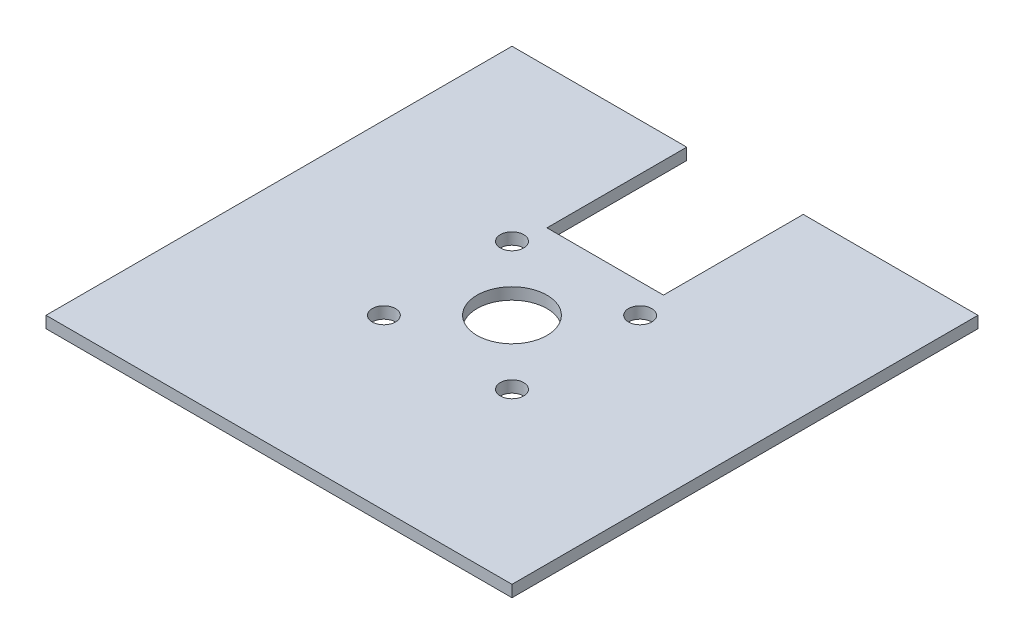
ISO-10303-21;
HEADER;
FILE_DESCRIPTION(('STEP AP214'),'2;1');
FILE_NAME('part.step','',(''),(''),'','','');
FILE_SCHEMA(('AUTOMOTIVE_DESIGN { 1 0 10303 214 1 1 1 1 }'));
ENDSEC;
DATA;
#1=APPLICATION_CONTEXT('core data for automotive mechanical design processes');
#2=APPLICATION_PROTOCOL_DEFINITION('international standard','automotive_design',2000,#1);
#3=PRODUCT_CONTEXT('',#1,'mechanical');
#4=PRODUCT('Part','Part','',(#3));
#5=PRODUCT_RELATED_PRODUCT_CATEGORY('part','',(#4));
#6=PRODUCT_DEFINITION_FORMATION('','',#4);
#7=PRODUCT_DEFINITION_CONTEXT('part definition',#1,'design');
#8=PRODUCT_DEFINITION('design','',#6,#7);
#9=PRODUCT_DEFINITION_SHAPE('','',#8);
#10=(LENGTH_UNIT() NAMED_UNIT(*) SI_UNIT(.MILLI.,.METRE.));
#11=(NAMED_UNIT(*) PLANE_ANGLE_UNIT() SI_UNIT($,.RADIAN.));
#12=(NAMED_UNIT(*) SI_UNIT($,.STERADIAN.) SOLID_ANGLE_UNIT());
#13=UNCERTAINTY_MEASURE_WITH_UNIT(LENGTH_MEASURE(1.E-05),#10,'distance_accuracy_value','');
#14=(GEOMETRIC_REPRESENTATION_CONTEXT(3) GLOBAL_UNCERTAINTY_ASSIGNED_CONTEXT((#13)) GLOBAL_UNIT_ASSIGNED_CONTEXT((#10,
#11,#12)) REPRESENTATION_CONTEXT('',''));
#15=CARTESIAN_POINT('',(0.,0.,0.));
#16=DIRECTION('',(0.,0.,1.));
#17=DIRECTION('',(1.,0.,0.));
#18=AXIS2_PLACEMENT_3D('',#15,#16,#17);
#19=CARTESIAN_POINT('',(0.,3.175,0.));
#20=DIRECTION('',(0.,1.,0.));
#21=DIRECTION('',(0.,0.,1.));
#22=AXIS2_PLACEMENT_3D('',#19,#20,#21);
#23=PLANE('',#22);
#24=CARTESIAN_POINT('',(34.9249999999997,3.175,34.9250000000002));
#25=DIRECTION('',(0.,1.,0.));
#26=DIRECTION('',(0.,0.,1.));
#27=AXIS2_PLACEMENT_3D('',#24,#25,#26);
#28=CIRCLE('',#27,6.35000000000002);
#29=CARTESIAN_POINT('',(34.9249999999997,3.175,41.2750000000002));
#30=VERTEX_POINT('',#29);
#31=EDGE_CURVE('E194',#30,#30,#28,.T.);
#32=ORIENTED_EDGE('',*,*,#31,.F.);
#33=EDGE_LOOP('',(#32));
#34=FACE_BOUND('',#33,.T.);
#35=CARTESIAN_POINT('',(-34.925,3.175,-34.925));
#36=DIRECTION('',(0.,1.,0.));
#37=DIRECTION('',(0.,0.,1.));
#38=AXIS2_PLACEMENT_3D('',#35,#36,#37);
#39=CIRCLE('',#38,6.35);
#40=CARTESIAN_POINT('',(-34.925,3.175,-28.575));
#41=VERTEX_POINT('',#40);
#42=EDGE_CURVE('E182',#41,#41,#39,.T.);
#43=ORIENTED_EDGE('',*,*,#42,.F.);
#44=EDGE_LOOP('',(#43));
#45=FACE_BOUND('',#44,.T.);
#46=DIRECTION('',(-1.,0.,0.));
#47=VECTOR('',#46,1.);
#48=CARTESIAN_POINT('',(31.7499999999998,3.175,-127.));
#49=LINE('',#48,#47);
#50=CARTESIAN_POINT('',(127.,3.175,-127.));
#51=VERTEX_POINT('',#50);
#52=CARTESIAN_POINT('',(31.7499999999998,3.175,-127.));
#53=VERTEX_POINT('',#52);
#54=EDGE_CURVE('E145',#51,#53,#49,.T.);
#55=ORIENTED_EDGE('',*,*,#54,.T.);
#56=DIRECTION('',(0.,0.,1.));
#57=VECTOR('',#56,1.);
#58=CARTESIAN_POINT('',(31.75,3.175,-50.8));
#59=LINE('',#58,#57);
#60=CARTESIAN_POINT('',(31.75,3.175,-50.8));
#61=VERTEX_POINT('',#60);
#62=EDGE_CURVE('E93',#53,#61,#59,.T.);
#63=ORIENTED_EDGE('',*,*,#62,.T.);
#64=DIRECTION('',(-1.,0.,0.));
#65=VECTOR('',#64,1.);
#66=CARTESIAN_POINT('',(-31.75,3.175,-50.8));
#67=LINE('',#66,#65);
#68=CARTESIAN_POINT('',(-31.75,3.175,-50.8));
#69=VERTEX_POINT('',#68);
#70=EDGE_CURVE('E160',#61,#69,#67,.T.);
#71=ORIENTED_EDGE('',*,*,#70,.T.);
#72=DIRECTION('',(0.,0.,-1.));
#73=VECTOR('',#72,1.);
#74=CARTESIAN_POINT('',(-31.75,3.175,-50.8));
#75=LINE('',#74,#73);
#76=CARTESIAN_POINT('',(-31.7500000000002,3.175,-127.));
#77=VERTEX_POINT('',#76);
#78=EDGE_CURVE('E173',#69,#77,#75,.T.);
#79=ORIENTED_EDGE('',*,*,#78,.T.);
#80=DIRECTION('',(-1.,0.,0.));
#81=VECTOR('',#80,1.);
#82=CARTESIAN_POINT('',(-127.,3.175,-127.));
#83=LINE('',#82,#81);
#84=CARTESIAN_POINT('',(-127.,3.175,-127.));
#85=VERTEX_POINT('',#84);
#86=EDGE_CURVE('E112',#77,#85,#83,.T.);
#87=ORIENTED_EDGE('',*,*,#86,.T.);
#88=DIRECTION('',(0.,0.,1.));
#89=VECTOR('',#88,1.);
#90=CARTESIAN_POINT('',(-127.,3.175,127.));
#91=LINE('',#90,#89);
#92=CARTESIAN_POINT('',(-127.,3.175,127.));
#93=VERTEX_POINT('',#92);
#94=EDGE_CURVE('E106',#85,#93,#91,.T.);
#95=ORIENTED_EDGE('',*,*,#94,.T.);
#96=DIRECTION('',(1.,0.,0.));
#97=VECTOR('',#96,1.);
#98=CARTESIAN_POINT('',(-127.,3.175,127.));
#99=LINE('',#98,#97);
#100=CARTESIAN_POINT('',(127.,3.175,127.));
#101=VERTEX_POINT('',#100);
#102=EDGE_CURVE('E110',#93,#101,#99,.T.);
#103=ORIENTED_EDGE('',*,*,#102,.T.);
#104=DIRECTION('',(0.,0.,-1.));
#105=VECTOR('',#104,1.);
#106=CARTESIAN_POINT('',(127.,3.175,127.));
#107=LINE('',#106,#105);
#108=EDGE_CURVE('E50',#101,#51,#107,.T.);
#109=ORIENTED_EDGE('',*,*,#108,.T.);
#110=EDGE_LOOP('',(#55,#63,#71,#79,#87,#95,#103,#109));
#111=FACE_BOUND('',#110,.T.);
#112=CARTESIAN_POINT('',(0.,3.175,0.));
#113=DIRECTION('',(0.,1.,0.));
#114=DIRECTION('',(0.,0.,1.));
#115=AXIS2_PLACEMENT_3D('',#112,#113,#114);
#116=CIRCLE('',#115,19.05);
#117=CARTESIAN_POINT('',(0.,3.175,19.05));
#118=VERTEX_POINT('',#117);
#119=EDGE_CURVE('E134',#118,#118,#116,.T.);
#120=ORIENTED_EDGE('',*,*,#119,.F.);
#121=EDGE_LOOP('',(#120));
#122=FACE_BOUND('',#121,.T.);
#123=CARTESIAN_POINT('',(34.9249999999997,3.175,-34.9250000000002));
#124=DIRECTION('',(0.,1.,0.));
#125=DIRECTION('',(0.,0.,-1.));
#126=AXIS2_PLACEMENT_3D('',#123,#124,#125);
#127=CIRCLE('',#126,6.35000000000002);
#128=CARTESIAN_POINT('',(34.9249999999997,3.175,-41.2750000000002));
#129=VERTEX_POINT('',#128);
#130=EDGE_CURVE('E188',#129,#129,#127,.T.);
#131=ORIENTED_EDGE('',*,*,#130,.F.);
#132=EDGE_LOOP('',(#131));
#133=FACE_BOUND('',#132,.T.);
#134=CARTESIAN_POINT('',(-34.925,3.175,34.925));
#135=DIRECTION('',(0.,1.,0.));
#136=DIRECTION('',(0.,0.,-1.));
#137=AXIS2_PLACEMENT_3D('',#134,#135,#136);
#138=CIRCLE('',#137,6.35);
#139=CARTESIAN_POINT('',(-34.925,3.175,28.575));
#140=VERTEX_POINT('',#139);
#141=EDGE_CURVE('E200',#140,#140,#138,.T.);
#142=ORIENTED_EDGE('',*,*,#141,.F.);
#143=EDGE_LOOP('',(#142));
#144=FACE_BOUND('',#143,.T.);
#145=ADVANCED_FACE('F33',(#34,#45,#111,#122,#133,#144),#23,.T.);
#146=CARTESIAN_POINT('',(0.,-3.175,0.));
#147=DIRECTION('',(0.,1.,0.));
#148=DIRECTION('',(0.,0.,1.));
#149=AXIS2_PLACEMENT_3D('',#146,#147,#148);
#150=PLANE('',#149);
#151=DIRECTION('',(-1.,0.,0.));
#152=VECTOR('',#151,1.);
#153=CARTESIAN_POINT('',(31.7499999999998,-3.175,-127.));
#154=LINE('',#153,#152);
#155=CARTESIAN_POINT('',(127.,-3.175,-127.));
#156=VERTEX_POINT('',#155);
#157=CARTESIAN_POINT('',(31.7499999999998,-3.175,-127.));
#158=VERTEX_POINT('',#157);
#159=EDGE_CURVE('E130',#156,#158,#154,.T.);
#160=ORIENTED_EDGE('',*,*,#159,.F.);
#161=DIRECTION('',(0.,0.,-1.));
#162=VECTOR('',#161,1.);
#163=CARTESIAN_POINT('',(127.,-3.175,127.));
#164=LINE('',#163,#162);
#165=CARTESIAN_POINT('',(127.,-3.175,127.));
#166=VERTEX_POINT('',#165);
#167=EDGE_CURVE('E85',#166,#156,#164,.T.);
#168=ORIENTED_EDGE('',*,*,#167,.F.);
#169=DIRECTION('',(1.,0.,0.));
#170=VECTOR('',#169,1.);
#171=CARTESIAN_POINT('',(-127.,-3.175,127.));
#172=LINE('',#171,#170);
#173=CARTESIAN_POINT('',(-127.,-3.175,127.));
#174=VERTEX_POINT('',#173);
#175=EDGE_CURVE('E79',#174,#166,#172,.T.);
#176=ORIENTED_EDGE('',*,*,#175,.F.);
#177=DIRECTION('',(0.,0.,1.));
#178=VECTOR('',#177,1.);
#179=CARTESIAN_POINT('',(-127.,-3.175,127.));
#180=LINE('',#179,#178);
#181=CARTESIAN_POINT('',(-127.,-3.175,-127.));
#182=VERTEX_POINT('',#181);
#183=EDGE_CURVE('E120',#182,#174,#180,.T.);
#184=ORIENTED_EDGE('',*,*,#183,.F.);
#185=DIRECTION('',(-1.,0.,0.));
#186=VECTOR('',#185,1.);
#187=CARTESIAN_POINT('',(-127.,-3.175,-127.));
#188=LINE('',#187,#186);
#189=CARTESIAN_POINT('',(-31.7500000000002,-3.175,-127.));
#190=VERTEX_POINT('',#189);
#191=EDGE_CURVE('E140',#190,#182,#188,.T.);
#192=ORIENTED_EDGE('',*,*,#191,.F.);
#193=DIRECTION('',(0.,0.,-1.));
#194=VECTOR('',#193,1.);
#195=CARTESIAN_POINT('',(-31.75,-3.175,-50.8));
#196=LINE('',#195,#194);
#197=CARTESIAN_POINT('',(-31.75,-3.175,-50.8));
#198=VERTEX_POINT('',#197);
#199=EDGE_CURVE('E138',#198,#190,#196,.T.);
#200=ORIENTED_EDGE('',*,*,#199,.F.);
#201=DIRECTION('',(-1.,0.,0.));
#202=VECTOR('',#201,1.);
#203=CARTESIAN_POINT('',(-31.75,-3.175,-50.8));
#204=LINE('',#203,#202);
#205=CARTESIAN_POINT('',(31.75,-3.175,-50.8));
#206=VERTEX_POINT('',#205);
#207=EDGE_CURVE('E136',#206,#198,#204,.T.);
#208=ORIENTED_EDGE('',*,*,#207,.F.);
#209=DIRECTION('',(0.,0.,1.));
#210=VECTOR('',#209,1.);
#211=CARTESIAN_POINT('',(31.75,-3.175,-50.8));
#212=LINE('',#211,#210);
#213=EDGE_CURVE('E133',#158,#206,#212,.T.);
#214=ORIENTED_EDGE('',*,*,#213,.F.);
#215=EDGE_LOOP('',(#160,#168,#176,#184,#192,#200,#208,#214));
#216=FACE_BOUND('',#215,.T.);
#217=CARTESIAN_POINT('',(0.,-3.175,0.));
#218=DIRECTION('',(0.,1.,0.));
#219=DIRECTION('',(0.,0.,1.));
#220=AXIS2_PLACEMENT_3D('',#217,#218,#219);
#221=CIRCLE('',#220,19.05);
#222=CARTESIAN_POINT('',(0.,-3.175,19.05));
#223=VERTEX_POINT('',#222);
#224=EDGE_CURVE('E179',#223,#223,#221,.T.);
#225=ORIENTED_EDGE('',*,*,#224,.T.);
#226=EDGE_LOOP('',(#225));
#227=FACE_BOUND('',#226,.T.);
#228=CARTESIAN_POINT('',(-34.925,-3.175,-34.925));
#229=DIRECTION('',(0.,1.,0.));
#230=DIRECTION('',(0.,0.,1.));
#231=AXIS2_PLACEMENT_3D('',#228,#229,#230);
#232=CIRCLE('',#231,6.35);
#233=CARTESIAN_POINT('',(-34.925,-3.175,-28.575));
#234=VERTEX_POINT('',#233);
#235=EDGE_CURVE('E185',#234,#234,#232,.T.);
#236=ORIENTED_EDGE('',*,*,#235,.T.);
#237=EDGE_LOOP('',(#236));
#238=FACE_BOUND('',#237,.T.);
#239=CARTESIAN_POINT('',(34.9249999999997,-3.175,-34.9250000000002));
#240=DIRECTION('',(0.,1.,0.));
#241=DIRECTION('',(0.,0.,-1.));
#242=AXIS2_PLACEMENT_3D('',#239,#240,#241);
#243=CIRCLE('',#242,6.35000000000002);
#244=CARTESIAN_POINT('',(34.9249999999997,-3.175,-41.2750000000002));
#245=VERTEX_POINT('',#244);
#246=EDGE_CURVE('E191',#245,#245,#243,.T.);
#247=ORIENTED_EDGE('',*,*,#246,.T.);
#248=EDGE_LOOP('',(#247));
#249=FACE_BOUND('',#248,.T.);
#250=CARTESIAN_POINT('',(34.9249999999997,-3.175,34.9250000000002));
#251=DIRECTION('',(0.,1.,0.));
#252=DIRECTION('',(0.,0.,1.));
#253=AXIS2_PLACEMENT_3D('',#250,#251,#252);
#254=CIRCLE('',#253,6.35000000000002);
#255=CARTESIAN_POINT('',(34.9249999999997,-3.175,41.2750000000002));
#256=VERTEX_POINT('',#255);
#257=EDGE_CURVE('E197',#256,#256,#254,.T.);
#258=ORIENTED_EDGE('',*,*,#257,.T.);
#259=EDGE_LOOP('',(#258));
#260=FACE_BOUND('',#259,.T.);
#261=CARTESIAN_POINT('',(-34.925,-3.175,34.925));
#262=DIRECTION('',(0.,1.,0.));
#263=DIRECTION('',(0.,0.,-1.));
#264=AXIS2_PLACEMENT_3D('',#261,#262,#263);
#265=CIRCLE('',#264,6.35);
#266=CARTESIAN_POINT('',(-34.925,-3.175,28.575));
#267=VERTEX_POINT('',#266);
#268=EDGE_CURVE('E203',#267,#267,#265,.T.);
#269=ORIENTED_EDGE('',*,*,#268,.T.);
#270=EDGE_LOOP('',(#269));
#271=FACE_BOUND('',#270,.T.);
#272=ADVANCED_FACE('F164',(#216,#227,#238,#249,#260,#271),#150,.F.);
#273=CARTESIAN_POINT('',(31.7499999999998,3.175,-127.));
#274=DIRECTION('',(0.,0.,1.));
#275=DIRECTION('',(1.,0.,0.));
#276=AXIS2_PLACEMENT_3D('',#273,#274,#275);
#277=PLANE('',#276);
#278=ORIENTED_EDGE('',*,*,#159,.T.);
#279=DIRECTION('',(0.,-1.,0.));
#280=VECTOR('',#279,1.);
#281=CARTESIAN_POINT('',(31.7499999999998,3.175,-127.));
#282=LINE('',#281,#280);
#283=EDGE_CURVE('E11',#53,#158,#282,.T.);
#284=ORIENTED_EDGE('',*,*,#283,.F.);
#285=ORIENTED_EDGE('',*,*,#54,.F.);
#286=DIRECTION('',(0.,-1.,0.));
#287=VECTOR('',#286,1.);
#288=CARTESIAN_POINT('',(127.,3.175,-127.));
#289=LINE('',#288,#287);
#290=EDGE_CURVE('E126',#51,#156,#289,.T.);
#291=ORIENTED_EDGE('',*,*,#290,.T.);
#292=EDGE_LOOP('',(#278,#284,#285,#291));
#293=FACE_BOUND('',#292,.T.);
#294=ADVANCED_FACE('F35',(#293),#277,.F.);
#295=CARTESIAN_POINT('',(31.75,3.175,-50.8));
#296=DIRECTION('',(1.,0.,0.));
#297=DIRECTION('',(0.,0.,-1.));
#298=AXIS2_PLACEMENT_3D('',#295,#296,#297);
#299=PLANE('',#298);
#300=ORIENTED_EDGE('',*,*,#213,.T.);
#301=DIRECTION('',(0.,-1.,0.));
#302=VECTOR('',#301,1.);
#303=CARTESIAN_POINT('',(31.75,3.175,-50.8));
#304=LINE('',#303,#302);
#305=EDGE_CURVE('E42',#61,#206,#304,.T.);
#306=ORIENTED_EDGE('',*,*,#305,.F.);
#307=ORIENTED_EDGE('',*,*,#62,.F.);
#308=ORIENTED_EDGE('',*,*,#283,.T.);
#309=EDGE_LOOP('',(#300,#306,#307,#308));
#310=FACE_BOUND('',#309,.T.);
#311=ADVANCED_FACE('F237',(#310),#299,.F.);
#312=CARTESIAN_POINT('',(-31.75,3.175,-50.8));
#313=DIRECTION('',(0.,0.,1.));
#314=DIRECTION('',(1.,0.,0.));
#315=AXIS2_PLACEMENT_3D('',#312,#313,#314);
#316=PLANE('',#315);
#317=ORIENTED_EDGE('',*,*,#207,.T.);
#318=DIRECTION('',(0.,-1.,0.));
#319=VECTOR('',#318,1.);
#320=CARTESIAN_POINT('',(-31.75,3.175,-50.8));
#321=LINE('',#320,#319);
#322=EDGE_CURVE('E152',#69,#198,#321,.T.);
#323=ORIENTED_EDGE('',*,*,#322,.F.);
#324=ORIENTED_EDGE('',*,*,#70,.F.);
#325=ORIENTED_EDGE('',*,*,#305,.T.);
#326=EDGE_LOOP('',(#317,#323,#324,#325));
#327=FACE_BOUND('',#326,.T.);
#328=ADVANCED_FACE('F158',(#327),#316,.F.);
#329=CARTESIAN_POINT('',(-31.75,3.175,-50.8));
#330=DIRECTION('',(-1.,0.,0.));
#331=DIRECTION('',(0.,0.,1.));
#332=AXIS2_PLACEMENT_3D('',#329,#330,#331);
#333=PLANE('',#332);
#334=ORIENTED_EDGE('',*,*,#199,.T.);
#335=DIRECTION('',(0.,-1.,0.));
#336=VECTOR('',#335,1.);
#337=CARTESIAN_POINT('',(-31.7500000000002,3.175,-127.));
#338=LINE('',#337,#336);
#339=EDGE_CURVE('E149',#77,#190,#338,.T.);
#340=ORIENTED_EDGE('',*,*,#339,.F.);
#341=ORIENTED_EDGE('',*,*,#78,.F.);
#342=ORIENTED_EDGE('',*,*,#322,.T.);
#343=EDGE_LOOP('',(#334,#340,#341,#342));
#344=FACE_BOUND('',#343,.T.);
#345=ADVANCED_FACE('F169',(#344),#333,.F.);
#346=CARTESIAN_POINT('',(-127.,3.175,-127.));
#347=DIRECTION('',(0.,0.,1.));
#348=DIRECTION('',(1.,0.,0.));
#349=AXIS2_PLACEMENT_3D('',#346,#347,#348);
#350=PLANE('',#349);
#351=ORIENTED_EDGE('',*,*,#191,.T.);
#352=DIRECTION('',(0.,-1.,0.));
#353=VECTOR('',#352,1.);
#354=CARTESIAN_POINT('',(-127.,3.175,-127.));
#355=LINE('',#354,#353);
#356=EDGE_CURVE('E121',#85,#182,#355,.T.);
#357=ORIENTED_EDGE('',*,*,#356,.F.);
#358=ORIENTED_EDGE('',*,*,#86,.F.);
#359=ORIENTED_EDGE('',*,*,#339,.T.);
#360=EDGE_LOOP('',(#351,#357,#358,#359));
#361=FACE_BOUND('',#360,.T.);
#362=ADVANCED_FACE('F172',(#361),#350,.F.);
#363=CARTESIAN_POINT('',(-127.,3.175,127.));
#364=DIRECTION('',(1.,0.,0.));
#365=DIRECTION('',(0.,0.,-1.));
#366=AXIS2_PLACEMENT_3D('',#363,#364,#365);
#367=PLANE('',#366);
#368=ORIENTED_EDGE('',*,*,#183,.T.);
#369=DIRECTION('',(0.,-1.,0.));
#370=VECTOR('',#369,1.);
#371=CARTESIAN_POINT('',(-127.,3.175,127.));
#372=LINE('',#371,#370);
#373=EDGE_CURVE('E117',#93,#174,#372,.T.);
#374=ORIENTED_EDGE('',*,*,#373,.F.);
#375=ORIENTED_EDGE('',*,*,#94,.F.);
#376=ORIENTED_EDGE('',*,*,#356,.T.);
#377=EDGE_LOOP('',(#368,#374,#375,#376));
#378=FACE_BOUND('',#377,.T.);
#379=ADVANCED_FACE('F118',(#378),#367,.F.);
#380=CARTESIAN_POINT('',(-127.,3.175,127.));
#381=DIRECTION('',(0.,0.,-1.));
#382=DIRECTION('',(-1.,0.,0.));
#383=AXIS2_PLACEMENT_3D('',#380,#381,#382);
#384=PLANE('',#383);
#385=ORIENTED_EDGE('',*,*,#175,.T.);
#386=DIRECTION('',(0.,-1.,0.));
#387=VECTOR('',#386,1.);
#388=CARTESIAN_POINT('',(127.,3.175,127.));
#389=LINE('',#388,#387);
#390=EDGE_CURVE('E122',#101,#166,#389,.T.);
#391=ORIENTED_EDGE('',*,*,#390,.F.);
#392=ORIENTED_EDGE('',*,*,#102,.F.);
#393=ORIENTED_EDGE('',*,*,#373,.T.);
#394=EDGE_LOOP('',(#385,#391,#392,#393));
#395=FACE_BOUND('',#394,.T.);
#396=ADVANCED_FACE('F124',(#395),#384,.F.);
#397=CARTESIAN_POINT('',(127.,3.175,127.));
#398=DIRECTION('',(-1.,0.,0.));
#399=DIRECTION('',(0.,0.,1.));
#400=AXIS2_PLACEMENT_3D('',#397,#398,#399);
#401=PLANE('',#400);
#402=ORIENTED_EDGE('',*,*,#167,.T.);
#403=ORIENTED_EDGE('',*,*,#290,.F.);
#404=ORIENTED_EDGE('',*,*,#108,.F.);
#405=ORIENTED_EDGE('',*,*,#390,.T.);
#406=EDGE_LOOP('',(#402,#403,#404,#405));
#407=FACE_BOUND('',#406,.T.);
#408=ADVANCED_FACE('F225',(#407),#401,.F.);
#409=CARTESIAN_POINT('',(0.,3.175,0.));
#410=DIRECTION('',(0.,-1.,0.));
#411=DIRECTION('',(0.,0.,-1.));
#412=AXIS2_PLACEMENT_3D('',#409,#410,#411);
#413=CYLINDRICAL_SURFACE('',#412,19.05);
#414=ORIENTED_EDGE('',*,*,#119,.T.);
#415=EDGE_LOOP('',(#414));
#416=FACE_BOUND('',#415,.T.);
#417=ORIENTED_EDGE('',*,*,#224,.F.);
#418=EDGE_LOOP('',(#417));
#419=FACE_BOUND('',#418,.T.);
#420=ADVANCED_FACE('F222',(#416,#419),#413,.F.);
#421=CARTESIAN_POINT('',(-34.925,3.175,-34.925));
#422=DIRECTION('',(0.,-1.,0.));
#423=DIRECTION('',(0.,0.,-1.));
#424=AXIS2_PLACEMENT_3D('',#421,#422,#423);
#425=CYLINDRICAL_SURFACE('',#424,6.35);
#426=ORIENTED_EDGE('',*,*,#42,.T.);
#427=EDGE_LOOP('',(#426));
#428=FACE_BOUND('',#427,.T.);
#429=ORIENTED_EDGE('',*,*,#235,.F.);
#430=EDGE_LOOP('',(#429));
#431=FACE_BOUND('',#430,.T.);
#432=ADVANCED_FACE('F301',(#428,#431),#425,.F.);
#433=CARTESIAN_POINT('',(34.9249999999997,3.175,-34.9250000000002));
#434=DIRECTION('',(0.,-1.,0.));
#435=DIRECTION('',(0.,0.,-1.));
#436=AXIS2_PLACEMENT_3D('',#433,#434,#435);
#437=CYLINDRICAL_SURFACE('',#436,6.35000000000002);
#438=ORIENTED_EDGE('',*,*,#130,.T.);
#439=EDGE_LOOP('',(#438));
#440=FACE_BOUND('',#439,.T.);
#441=ORIENTED_EDGE('',*,*,#246,.F.);
#442=EDGE_LOOP('',(#441));
#443=FACE_BOUND('',#442,.T.);
#444=ADVANCED_FACE('F309',(#440,#443),#437,.F.);
#445=CARTESIAN_POINT('',(34.9249999999997,3.175,34.9250000000002));
#446=DIRECTION('',(0.,-1.,0.));
#447=DIRECTION('',(0.,0.,-1.));
#448=AXIS2_PLACEMENT_3D('',#445,#446,#447);
#449=CYLINDRICAL_SURFACE('',#448,6.35000000000002);
#450=ORIENTED_EDGE('',*,*,#31,.T.);
#451=EDGE_LOOP('',(#450));
#452=FACE_BOUND('',#451,.T.);
#453=ORIENTED_EDGE('',*,*,#257,.F.);
#454=EDGE_LOOP('',(#453));
#455=FACE_BOUND('',#454,.T.);
#456=ADVANCED_FACE('F317',(#452,#455),#449,.F.);
#457=CARTESIAN_POINT('',(-34.925,3.175,34.925));
#458=DIRECTION('',(0.,-1.,0.));
#459=DIRECTION('',(0.,0.,-1.));
#460=AXIS2_PLACEMENT_3D('',#457,#458,#459);
#461=CYLINDRICAL_SURFACE('',#460,6.35);
#462=ORIENTED_EDGE('',*,*,#141,.T.);
#463=EDGE_LOOP('',(#462));
#464=FACE_BOUND('',#463,.T.);
#465=ORIENTED_EDGE('',*,*,#268,.F.);
#466=EDGE_LOOP('',(#465));
#467=FACE_BOUND('',#466,.T.);
#468=ADVANCED_FACE('F209',(#464,#467),#461,.F.);
#469=CLOSED_SHELL('',(#145,#272,#294,#311,#328,#345,#362,#379,#396,#408,#420,#432,#444,#456,#468));
#470=MANIFOLD_SOLID_BREP('B2',#469);
#471=ADVANCED_BREP_SHAPE_REPRESENTATION('',(#18,#470),#14);
#472=SHAPE_DEFINITION_REPRESENTATION(#9,#471);
ENDSEC;
END-ISO-10303-21;
